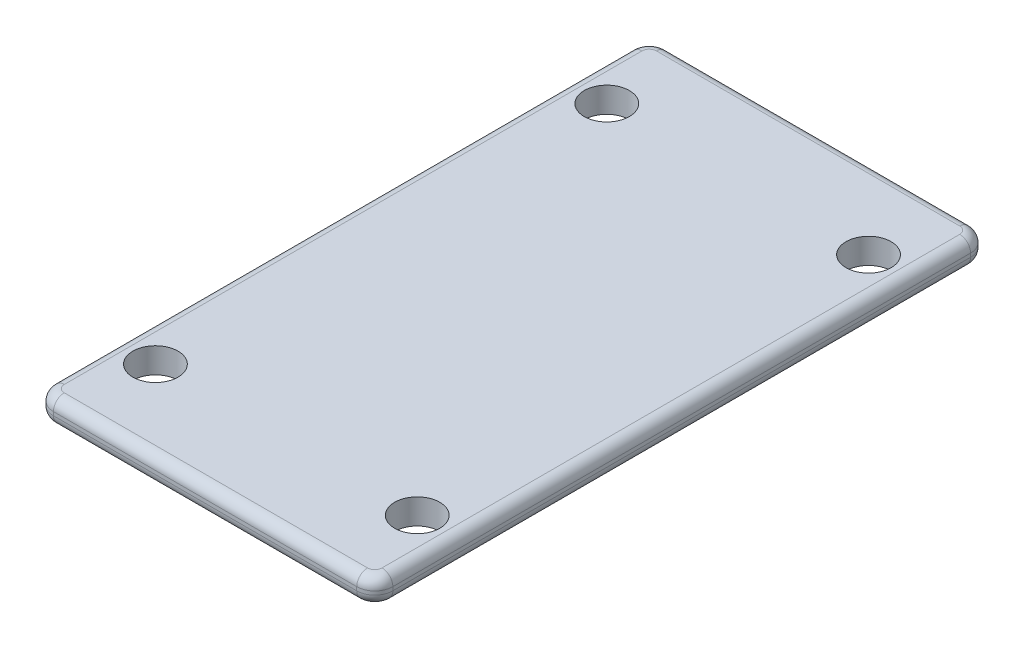
ISO-10303-21;
HEADER;
FILE_DESCRIPTION(('STEP AP214'),'2;1');
FILE_NAME('part.step','',(''),(''),'','','');
FILE_SCHEMA(('AUTOMOTIVE_DESIGN { 1 0 10303 214 1 1 1 1 }'));
ENDSEC;
DATA;
#1=APPLICATION_CONTEXT('core data for automotive mechanical design processes');
#2=APPLICATION_PROTOCOL_DEFINITION('international standard','automotive_design',2000,#1);
#3=PRODUCT_CONTEXT('',#1,'mechanical');
#4=PRODUCT('Part','Part','',(#3));
#5=PRODUCT_RELATED_PRODUCT_CATEGORY('part','',(#4));
#6=PRODUCT_DEFINITION_FORMATION('','',#4);
#7=PRODUCT_DEFINITION_CONTEXT('part definition',#1,'design');
#8=PRODUCT_DEFINITION('design','',#6,#7);
#9=PRODUCT_DEFINITION_SHAPE('','',#8);
#10=(LENGTH_UNIT() NAMED_UNIT(*) SI_UNIT(.MILLI.,.METRE.));
#11=(NAMED_UNIT(*) PLANE_ANGLE_UNIT() SI_UNIT($,.RADIAN.));
#12=(NAMED_UNIT(*) SI_UNIT($,.STERADIAN.) SOLID_ANGLE_UNIT());
#13=UNCERTAINTY_MEASURE_WITH_UNIT(LENGTH_MEASURE(1.E-05),#10,'distance_accuracy_value','');
#14=(GEOMETRIC_REPRESENTATION_CONTEXT(3) GLOBAL_UNCERTAINTY_ASSIGNED_CONTEXT((#13)) GLOBAL_UNIT_ASSIGNED_CONTEXT((#10,
#11,#12)) REPRESENTATION_CONTEXT('',''));
#15=CARTESIAN_POINT('',(0.,0.,0.));
#16=DIRECTION('',(0.,0.,1.));
#17=DIRECTION('',(1.,0.,0.));
#18=AXIS2_PLACEMENT_3D('',#15,#16,#17);
#19=CARTESIAN_POINT('',(0.,1.4,0.));
#20=DIRECTION('',(0.,1.,0.));
#21=DIRECTION('',(0.,0.,1.));
#22=AXIS2_PLACEMENT_3D('',#19,#20,#21);
#23=PLANE('',#22);
#24=CARTESIAN_POINT('',(8.4,1.4,16.));
#25=DIRECTION('',(0.,1.,0.));
#26=DIRECTION('',(0.,0.,1.));
#27=AXIS2_PLACEMENT_3D('',#24,#25,#26);
#28=CIRCLE('',#27,0.4);
#29=CARTESIAN_POINT('',(8.4,1.4,16.4));
#30=VERTEX_POINT('',#29);
#31=CARTESIAN_POINT('',(8.8,1.4,16.));
#32=VERTEX_POINT('',#31);
#33=EDGE_CURVE('E56',#30,#32,#28,.T.);
#34=ORIENTED_EDGE('',*,*,#33,.T.);
#35=DIRECTION('',(0.,0.,-1.));
#36=VECTOR('',#35,1.);
#37=CARTESIAN_POINT('',(8.8,1.4,-16.));
#38=LINE('',#37,#36);
#39=CARTESIAN_POINT('',(8.8,1.4,-16.));
#40=VERTEX_POINT('',#39);
#41=EDGE_CURVE('E51',#32,#40,#38,.T.);
#42=ORIENTED_EDGE('',*,*,#41,.T.);
#43=CARTESIAN_POINT('',(8.4,1.4,-16.));
#44=DIRECTION('',(0.,1.,0.));
#45=DIRECTION('',(0.,0.,1.));
#46=AXIS2_PLACEMENT_3D('',#43,#44,#45);
#47=CIRCLE('',#46,0.4);
#48=CARTESIAN_POINT('',(8.4,1.4,-16.4));
#49=VERTEX_POINT('',#48);
#50=EDGE_CURVE('E220',#40,#49,#47,.T.);
#51=ORIENTED_EDGE('',*,*,#50,.T.);
#52=DIRECTION('',(-1.,0.,0.));
#53=VECTOR('',#52,1.);
#54=CARTESIAN_POINT('',(-8.4,1.4,-16.4));
#55=LINE('',#54,#53);
#56=CARTESIAN_POINT('',(-8.4,1.4,-16.4));
#57=VERTEX_POINT('',#56);
#58=EDGE_CURVE('E215',#49,#57,#55,.T.);
#59=ORIENTED_EDGE('',*,*,#58,.T.);
#60=CARTESIAN_POINT('',(-8.4,1.4,-16.));
#61=DIRECTION('',(0.,1.,0.));
#62=DIRECTION('',(0.,0.,1.));
#63=AXIS2_PLACEMENT_3D('',#60,#61,#62);
#64=CIRCLE('',#63,0.4);
#65=CARTESIAN_POINT('',(-8.8,1.4,-16.));
#66=VERTEX_POINT('',#65);
#67=EDGE_CURVE('E212',#57,#66,#64,.T.);
#68=ORIENTED_EDGE('',*,*,#67,.T.);
#69=DIRECTION('',(0.,0.,1.));
#70=VECTOR('',#69,1.);
#71=CARTESIAN_POINT('',(-8.8,1.4,16.));
#72=LINE('',#71,#70);
#73=CARTESIAN_POINT('',(-8.8,1.4,16.));
#74=VERTEX_POINT('',#73);
#75=EDGE_CURVE('E208',#66,#74,#72,.T.);
#76=ORIENTED_EDGE('',*,*,#75,.T.);
#77=CARTESIAN_POINT('',(-8.4,1.4,16.));
#78=DIRECTION('',(0.,1.,0.));
#79=DIRECTION('',(0.,0.,1.));
#80=AXIS2_PLACEMENT_3D('',#77,#78,#79);
#81=CIRCLE('',#80,0.4);
#82=CARTESIAN_POINT('',(-8.4,1.4,16.4));
#83=VERTEX_POINT('',#82);
#84=EDGE_CURVE('E210',#74,#83,#81,.T.);
#85=ORIENTED_EDGE('',*,*,#84,.T.);
#86=DIRECTION('',(1.,0.,0.));
#87=VECTOR('',#86,1.);
#88=CARTESIAN_POINT('',(8.4,1.4,16.4));
#89=LINE('',#88,#87);
#90=EDGE_CURVE('E217',#83,#30,#89,.T.);
#91=ORIENTED_EDGE('',*,*,#90,.T.);
#92=EDGE_LOOP('',(#34,#42,#51,#59,#68,#76,#85,#91));
#93=FACE_BOUND('',#92,.T.);
#94=CARTESIAN_POINT('',(-7.25,1.4,12.5));
#95=DIRECTION('',(0.,1.,0.));
#96=DIRECTION('',(0.,0.,1.));
#97=AXIS2_PLACEMENT_3D('',#94,#95,#96);
#98=CIRCLE('',#97,1.25);
#99=CARTESIAN_POINT('',(-7.25,1.4,13.75));
#100=VERTEX_POINT('',#99);
#101=EDGE_CURVE('E638',#100,#100,#98,.T.);
#102=ORIENTED_EDGE('',*,*,#101,.F.);
#103=EDGE_LOOP('',(#102));
#104=FACE_BOUND('',#103,.T.);
#105=CARTESIAN_POINT('',(-7.25,1.4,-12.5));
#106=DIRECTION('',(0.,1.,0.));
#107=DIRECTION('',(0.,0.,1.));
#108=AXIS2_PLACEMENT_3D('',#105,#106,#107);
#109=CIRCLE('',#108,1.25);
#110=CARTESIAN_POINT('',(-7.25,1.4,-11.25));
#111=VERTEX_POINT('',#110);
#112=EDGE_CURVE('E294',#111,#111,#109,.T.);
#113=ORIENTED_EDGE('',*,*,#112,.F.);
#114=EDGE_LOOP('',(#113));
#115=FACE_BOUND('',#114,.T.);
#116=CARTESIAN_POINT('',(7.25,1.4,-12.5));
#117=DIRECTION('',(0.,1.,0.));
#118=DIRECTION('',(0.,0.,1.));
#119=AXIS2_PLACEMENT_3D('',#116,#117,#118);
#120=CIRCLE('',#119,1.25);
#121=CARTESIAN_POINT('',(7.25,1.4,-11.25));
#122=VERTEX_POINT('',#121);
#123=EDGE_CURVE('E632',#122,#122,#120,.T.);
#124=ORIENTED_EDGE('',*,*,#123,.F.);
#125=EDGE_LOOP('',(#124));
#126=FACE_BOUND('',#125,.T.);
#127=CARTESIAN_POINT('',(7.25,1.4,12.5));
#128=DIRECTION('',(0.,1.,0.));
#129=DIRECTION('',(0.,0.,1.));
#130=AXIS2_PLACEMENT_3D('',#127,#128,#129);
#131=CIRCLE('',#130,1.25);
#132=CARTESIAN_POINT('',(7.25,1.4,13.75));
#133=VERTEX_POINT('',#132);
#134=EDGE_CURVE('E644',#133,#133,#131,.T.);
#135=ORIENTED_EDGE('',*,*,#134,.F.);
#136=EDGE_LOOP('',(#135));
#137=FACE_BOUND('',#136,.T.);
#138=ADVANCED_FACE('F34',(#93,#104,#115,#126,#137),#23,.T.);
#139=CARTESIAN_POINT('',(0.,0.,0.));
#140=DIRECTION('',(0.,1.,0.));
#141=DIRECTION('',(0.,0.,1.));
#142=AXIS2_PLACEMENT_3D('',#139,#140,#141);
#143=PLANE('',#142);
#144=CARTESIAN_POINT('',(8.4,0.,-16.));
#145=DIRECTION('',(0.,1.,0.));
#146=DIRECTION('',(0.,0.,1.));
#147=AXIS2_PLACEMENT_3D('',#144,#145,#146);
#148=CIRCLE('',#147,0.4);
#149=CARTESIAN_POINT('',(8.4,0.,-16.4));
#150=VERTEX_POINT('',#149);
#151=CARTESIAN_POINT('',(8.8,0.,-16.));
#152=VERTEX_POINT('',#151);
#153=EDGE_CURVE('E187',#150,#152,#148,.F.);
#154=ORIENTED_EDGE('',*,*,#153,.T.);
#155=DIRECTION('',(0.,0.,-1.));
#156=VECTOR('',#155,1.);
#157=CARTESIAN_POINT('',(8.8,0.,0.));
#158=LINE('',#157,#156);
#159=CARTESIAN_POINT('',(8.8,0.,16.));
#160=VERTEX_POINT('',#159);
#161=EDGE_CURVE('E189',#152,#160,#158,.F.);
#162=ORIENTED_EDGE('',*,*,#161,.T.);
#163=CARTESIAN_POINT('',(8.4,0.,16.));
#164=DIRECTION('',(0.,1.,0.));
#165=DIRECTION('',(0.,0.,1.));
#166=AXIS2_PLACEMENT_3D('',#163,#164,#165);
#167=CIRCLE('',#166,0.4);
#168=CARTESIAN_POINT('',(8.4,0.,16.4));
#169=VERTEX_POINT('',#168);
#170=EDGE_CURVE('E185',#160,#169,#167,.F.);
#171=ORIENTED_EDGE('',*,*,#170,.T.);
#172=DIRECTION('',(1.,0.,0.));
#173=VECTOR('',#172,1.);
#174=CARTESIAN_POINT('',(0.,0.,16.4));
#175=LINE('',#174,#173);
#176=CARTESIAN_POINT('',(-8.4,0.,16.4));
#177=VERTEX_POINT('',#176);
#178=EDGE_CURVE('E155',#169,#177,#175,.F.);
#179=ORIENTED_EDGE('',*,*,#178,.T.);
#180=CARTESIAN_POINT('',(-8.4,0.,16.));
#181=DIRECTION('',(0.,1.,0.));
#182=DIRECTION('',(0.,0.,1.));
#183=AXIS2_PLACEMENT_3D('',#180,#181,#182);
#184=CIRCLE('',#183,0.4);
#185=CARTESIAN_POINT('',(-8.8,0.,16.));
#186=VERTEX_POINT('',#185);
#187=EDGE_CURVE('E146',#177,#186,#184,.F.);
#188=ORIENTED_EDGE('',*,*,#187,.T.);
#189=DIRECTION('',(0.,0.,1.));
#190=VECTOR('',#189,1.);
#191=CARTESIAN_POINT('',(-8.8,0.,0.));
#192=LINE('',#191,#190);
#193=CARTESIAN_POINT('',(-8.8,0.,-16.));
#194=VERTEX_POINT('',#193);
#195=EDGE_CURVE('E152',#186,#194,#192,.F.);
#196=ORIENTED_EDGE('',*,*,#195,.T.);
#197=CARTESIAN_POINT('',(-8.4,0.,-16.));
#198=DIRECTION('',(0.,1.,0.));
#199=DIRECTION('',(0.,0.,1.));
#200=AXIS2_PLACEMENT_3D('',#197,#198,#199);
#201=CIRCLE('',#200,0.4);
#202=CARTESIAN_POINT('',(-8.4,0.,-16.4));
#203=VERTEX_POINT('',#202);
#204=EDGE_CURVE('E159',#194,#203,#201,.F.);
#205=ORIENTED_EDGE('',*,*,#204,.T.);
#206=DIRECTION('',(-1.,0.,0.));
#207=VECTOR('',#206,1.);
#208=CARTESIAN_POINT('',(0.,0.,-16.4));
#209=LINE('',#208,#207);
#210=EDGE_CURVE('E182',#203,#150,#209,.F.);
#211=ORIENTED_EDGE('',*,*,#210,.T.);
#212=EDGE_LOOP('',(#154,#162,#171,#179,#188,#196,#205,#211));
#213=FACE_BOUND('',#212,.T.);
#214=CARTESIAN_POINT('',(-7.25,0.,-12.5));
#215=DIRECTION('',(0.,1.,0.));
#216=DIRECTION('',(0.,0.,1.));
#217=AXIS2_PLACEMENT_3D('',#214,#215,#216);
#218=CIRCLE('',#217,1.25);
#219=CARTESIAN_POINT('',(-7.25,0.,-11.25));
#220=VERTEX_POINT('',#219);
#221=EDGE_CURVE('E299',#220,#220,#218,.T.);
#222=ORIENTED_EDGE('',*,*,#221,.T.);
#223=EDGE_LOOP('',(#222));
#224=FACE_BOUND('',#223,.T.);
#225=CARTESIAN_POINT('',(7.25,0.,-12.5));
#226=DIRECTION('',(0.,1.,0.));
#227=DIRECTION('',(0.,0.,1.));
#228=AXIS2_PLACEMENT_3D('',#225,#226,#227);
#229=CIRCLE('',#228,1.25);
#230=CARTESIAN_POINT('',(7.25,0.,-11.25));
#231=VERTEX_POINT('',#230);
#232=EDGE_CURVE('E634',#231,#231,#229,.T.);
#233=ORIENTED_EDGE('',*,*,#232,.T.);
#234=EDGE_LOOP('',(#233));
#235=FACE_BOUND('',#234,.T.);
#236=CARTESIAN_POINT('',(-7.25,0.,12.5));
#237=DIRECTION('',(0.,1.,0.));
#238=DIRECTION('',(0.,0.,1.));
#239=AXIS2_PLACEMENT_3D('',#236,#237,#238);
#240=CIRCLE('',#239,1.25);
#241=CARTESIAN_POINT('',(-7.25,0.,13.75));
#242=VERTEX_POINT('',#241);
#243=EDGE_CURVE('E641',#242,#242,#240,.T.);
#244=ORIENTED_EDGE('',*,*,#243,.T.);
#245=EDGE_LOOP('',(#244));
#246=FACE_BOUND('',#245,.T.);
#247=CARTESIAN_POINT('',(7.25,0.,12.5));
#248=DIRECTION('',(0.,1.,0.));
#249=DIRECTION('',(0.,0.,1.));
#250=AXIS2_PLACEMENT_3D('',#247,#248,#249);
#251=CIRCLE('',#250,1.25);
#252=CARTESIAN_POINT('',(7.25,0.,13.75));
#253=VERTEX_POINT('',#252);
#254=EDGE_CURVE('E251',#253,#253,#251,.T.);
#255=ORIENTED_EDGE('',*,*,#254,.T.);
#256=EDGE_LOOP('',(#255));
#257=FACE_BOUND('',#256,.T.);
#258=ADVANCED_FACE('F148',(#213,#224,#235,#246,#257),#143,.F.);
#259=CARTESIAN_POINT('',(-9.4,1.4,17.));
#260=DIRECTION('',(1.,0.,0.));
#261=DIRECTION('',(0.,0.,-1.));
#262=AXIS2_PLACEMENT_3D('',#259,#260,#261);
#263=PLANE('',#262);
#264=DIRECTION('',(0.,-1.,0.));
#265=VECTOR('',#264,1.);
#266=CARTESIAN_POINT('',(-9.4,1.4,-16.));
#267=LINE('',#266,#265);
#268=CARTESIAN_POINT('',(-9.4,0.8,-16.));
#269=VERTEX_POINT('',#268);
#270=CARTESIAN_POINT('',(-9.4,0.6,-16.));
#271=VERTEX_POINT('',#270);
#272=EDGE_CURVE('E296',#269,#271,#267,.T.);
#273=ORIENTED_EDGE('',*,*,#272,.T.);
#274=DIRECTION('',(0.,0.,1.));
#275=VECTOR('',#274,1.);
#276=CARTESIAN_POINT('',(-9.4,0.6,17.));
#277=LINE('',#276,#275);
#278=CARTESIAN_POINT('',(-9.4,0.6,16.));
#279=VERTEX_POINT('',#278);
#280=EDGE_CURVE('E11',#271,#279,#277,.T.);
#281=ORIENTED_EDGE('',*,*,#280,.T.);
#282=DIRECTION('',(0.,-1.,0.));
#283=VECTOR('',#282,1.);
#284=CARTESIAN_POINT('',(-9.4,1.4,16.));
#285=LINE('',#284,#283);
#286=CARTESIAN_POINT('',(-9.4,0.8,16.));
#287=VERTEX_POINT('',#286);
#288=EDGE_CURVE('E305',#279,#287,#285,.F.);
#289=ORIENTED_EDGE('',*,*,#288,.T.);
#290=DIRECTION('',(0.,0.,1.));
#291=VECTOR('',#290,1.);
#292=CARTESIAN_POINT('',(-9.4,0.8,-16.));
#293=LINE('',#292,#291);
#294=EDGE_CURVE('E43',#287,#269,#293,.F.);
#295=ORIENTED_EDGE('',*,*,#294,.T.);
#296=EDGE_LOOP('',(#273,#281,#289,#295));
#297=FACE_BOUND('',#296,.T.);
#298=ADVANCED_FACE('F359',(#297),#263,.F.);
#299=CARTESIAN_POINT('',(9.4,1.4,17.));
#300=DIRECTION('',(0.,0.,-1.));
#301=DIRECTION('',(-1.,0.,0.));
#302=AXIS2_PLACEMENT_3D('',#299,#300,#301);
#303=PLANE('',#302);
#304=DIRECTION('',(0.,-1.,0.));
#305=VECTOR('',#304,1.);
#306=CARTESIAN_POINT('',(-8.4,1.4,17.));
#307=LINE('',#306,#305);
#308=CARTESIAN_POINT('',(-8.4,0.8,17.));
#309=VERTEX_POINT('',#308);
#310=CARTESIAN_POINT('',(-8.4,0.6,17.));
#311=VERTEX_POINT('',#310);
#312=EDGE_CURVE('E293',#309,#311,#307,.T.);
#313=ORIENTED_EDGE('',*,*,#312,.T.);
#314=DIRECTION('',(1.,0.,0.));
#315=VECTOR('',#314,1.);
#316=CARTESIAN_POINT('',(9.4,0.6,17.));
#317=LINE('',#316,#315);
#318=CARTESIAN_POINT('',(8.4,0.6,17.));
#319=VERTEX_POINT('',#318);
#320=EDGE_CURVE('E225',#311,#319,#317,.T.);
#321=ORIENTED_EDGE('',*,*,#320,.T.);
#322=DIRECTION('',(0.,-1.,0.));
#323=VECTOR('',#322,1.);
#324=CARTESIAN_POINT('',(8.4,1.4,17.));
#325=LINE('',#324,#323);
#326=CARTESIAN_POINT('',(8.4,0.8,17.));
#327=VERTEX_POINT('',#326);
#328=EDGE_CURVE('E284',#319,#327,#325,.F.);
#329=ORIENTED_EDGE('',*,*,#328,.T.);
#330=DIRECTION('',(1.,0.,0.));
#331=VECTOR('',#330,1.);
#332=CARTESIAN_POINT('',(-8.4,0.8,17.));
#333=LINE('',#332,#331);
#334=EDGE_CURVE('E223',#327,#309,#333,.F.);
#335=ORIENTED_EDGE('',*,*,#334,.T.);
#336=EDGE_LOOP('',(#313,#321,#329,#335));
#337=FACE_BOUND('',#336,.T.);
#338=ADVANCED_FACE('F290',(#337),#303,.F.);
#339=CARTESIAN_POINT('',(9.4,1.4,17.));
#340=DIRECTION('',(-1.,0.,0.));
#341=DIRECTION('',(0.,0.,1.));
#342=AXIS2_PLACEMENT_3D('',#339,#340,#341);
#343=PLANE('',#342);
#344=DIRECTION('',(0.,-1.,0.));
#345=VECTOR('',#344,1.);
#346=CARTESIAN_POINT('',(9.4,1.4,16.));
#347=LINE('',#346,#345);
#348=CARTESIAN_POINT('',(9.4,0.8,16.));
#349=VERTEX_POINT('',#348);
#350=CARTESIAN_POINT('',(9.4,0.6,16.));
#351=VERTEX_POINT('',#350);
#352=EDGE_CURVE('E287',#349,#351,#347,.T.);
#353=ORIENTED_EDGE('',*,*,#352,.T.);
#354=DIRECTION('',(0.,0.,-1.));
#355=VECTOR('',#354,1.);
#356=CARTESIAN_POINT('',(9.4,0.6,17.));
#357=LINE('',#356,#355);
#358=CARTESIAN_POINT('',(9.4,0.6,-16.));
#359=VERTEX_POINT('',#358);
#360=EDGE_CURVE('E229',#351,#359,#357,.T.);
#361=ORIENTED_EDGE('',*,*,#360,.T.);
#362=DIRECTION('',(0.,-1.,0.));
#363=VECTOR('',#362,1.);
#364=CARTESIAN_POINT('',(9.4,1.4,-16.));
#365=LINE('',#364,#363);
#366=CARTESIAN_POINT('',(9.4,0.8,-16.));
#367=VERTEX_POINT('',#366);
#368=EDGE_CURVE('E308',#359,#367,#365,.F.);
#369=ORIENTED_EDGE('',*,*,#368,.T.);
#370=DIRECTION('',(0.,0.,-1.));
#371=VECTOR('',#370,1.);
#372=CARTESIAN_POINT('',(9.4,0.8,16.));
#373=LINE('',#372,#371);
#374=EDGE_CURVE('E227',#367,#349,#373,.F.);
#375=ORIENTED_EDGE('',*,*,#374,.T.);
#376=EDGE_LOOP('',(#353,#361,#369,#375));
#377=FACE_BOUND('',#376,.T.);
#378=ADVANCED_FACE('F368',(#377),#343,.F.);
#379=CARTESIAN_POINT('',(9.4,1.4,-17.));
#380=DIRECTION('',(0.,0.,1.));
#381=DIRECTION('',(1.,0.,0.));
#382=AXIS2_PLACEMENT_3D('',#379,#380,#381);
#383=PLANE('',#382);
#384=DIRECTION('',(0.,-1.,0.));
#385=VECTOR('',#384,1.);
#386=CARTESIAN_POINT('',(8.4,1.4,-17.));
#387=LINE('',#386,#385);
#388=CARTESIAN_POINT('',(8.4,0.8,-17.));
#389=VERTEX_POINT('',#388);
#390=CARTESIAN_POINT('',(8.4,0.6,-17.));
#391=VERTEX_POINT('',#390);
#392=EDGE_CURVE('E174',#389,#391,#387,.T.);
#393=ORIENTED_EDGE('',*,*,#392,.T.);
#394=DIRECTION('',(-1.,0.,0.));
#395=VECTOR('',#394,1.);
#396=CARTESIAN_POINT('',(9.4,0.6,-17.));
#397=LINE('',#396,#395);
#398=CARTESIAN_POINT('',(-8.4,0.6,-17.));
#399=VERTEX_POINT('',#398);
#400=EDGE_CURVE('E233',#391,#399,#397,.T.);
#401=ORIENTED_EDGE('',*,*,#400,.T.);
#402=DIRECTION('',(0.,-1.,0.));
#403=VECTOR('',#402,1.);
#404=CARTESIAN_POINT('',(-8.4,1.4,-17.));
#405=LINE('',#404,#403);
#406=CARTESIAN_POINT('',(-8.4,0.8,-17.));
#407=VERTEX_POINT('',#406);
#408=EDGE_CURVE('E177',#399,#407,#405,.F.);
#409=ORIENTED_EDGE('',*,*,#408,.T.);
#410=DIRECTION('',(-1.,0.,0.));
#411=VECTOR('',#410,1.);
#412=CARTESIAN_POINT('',(8.4,0.8,-17.));
#413=LINE('',#412,#411);
#414=EDGE_CURVE('E231',#407,#389,#413,.F.);
#415=ORIENTED_EDGE('',*,*,#414,.T.);
#416=EDGE_LOOP('',(#393,#401,#409,#415));
#417=FACE_BOUND('',#416,.T.);
#418=ADVANCED_FACE('F314',(#417),#383,.F.);
#419=CARTESIAN_POINT('',(-7.25,1.4,-12.5));
#420=DIRECTION('',(0.,-1.,0.));
#421=DIRECTION('',(0.,0.,-1.));
#422=AXIS2_PLACEMENT_3D('',#419,#420,#421);
#423=CYLINDRICAL_SURFACE('',#422,1.25);
#424=ORIENTED_EDGE('',*,*,#112,.T.);
#425=EDGE_LOOP('',(#424));
#426=FACE_BOUND('',#425,.T.);
#427=ORIENTED_EDGE('',*,*,#221,.F.);
#428=EDGE_LOOP('',(#427));
#429=FACE_BOUND('',#428,.T.);
#430=ADVANCED_FACE('F363',(#426,#429),#423,.F.);
#431=CARTESIAN_POINT('',(7.25,1.4,-12.5));
#432=DIRECTION('',(0.,-1.,0.));
#433=DIRECTION('',(0.,0.,-1.));
#434=AXIS2_PLACEMENT_3D('',#431,#432,#433);
#435=CYLINDRICAL_SURFACE('',#434,1.25);
#436=ORIENTED_EDGE('',*,*,#123,.T.);
#437=EDGE_LOOP('',(#436));
#438=FACE_BOUND('',#437,.T.);
#439=ORIENTED_EDGE('',*,*,#232,.F.);
#440=EDGE_LOOP('',(#439));
#441=FACE_BOUND('',#440,.T.);
#442=ADVANCED_FACE('F569',(#438,#441),#435,.F.);
#443=CARTESIAN_POINT('',(-7.25,1.4,12.5));
#444=DIRECTION('',(0.,-1.,0.));
#445=DIRECTION('',(0.,0.,-1.));
#446=AXIS2_PLACEMENT_3D('',#443,#444,#445);
#447=CYLINDRICAL_SURFACE('',#446,1.25);
#448=ORIENTED_EDGE('',*,*,#101,.T.);
#449=EDGE_LOOP('',(#448));
#450=FACE_BOUND('',#449,.T.);
#451=ORIENTED_EDGE('',*,*,#243,.F.);
#452=EDGE_LOOP('',(#451));
#453=FACE_BOUND('',#452,.T.);
#454=ADVANCED_FACE('F560',(#450,#453),#447,.F.);
#455=CARTESIAN_POINT('',(7.25,1.4,12.5));
#456=DIRECTION('',(0.,-1.,0.));
#457=DIRECTION('',(0.,0.,-1.));
#458=AXIS2_PLACEMENT_3D('',#455,#456,#457);
#459=CYLINDRICAL_SURFACE('',#458,1.25);
#460=ORIENTED_EDGE('',*,*,#134,.T.);
#461=EDGE_LOOP('',(#460));
#462=FACE_BOUND('',#461,.T.);
#463=ORIENTED_EDGE('',*,*,#254,.F.);
#464=EDGE_LOOP('',(#463));
#465=FACE_BOUND('',#464,.T.);
#466=ADVANCED_FACE('F380',(#462,#465),#459,.F.);
#467=CARTESIAN_POINT('',(-8.4,1.4,16.));
#468=DIRECTION('',(0.,-1.,0.));
#469=DIRECTION('',(0.,0.,-1.));
#470=AXIS2_PLACEMENT_3D('',#467,#468,#469);
#471=CYLINDRICAL_SURFACE('',#470,1.);
#472=ORIENTED_EDGE('',*,*,#288,.F.);
#473=CARTESIAN_POINT('',(-8.4,0.6,16.));
#474=DIRECTION('',(0.,1.,0.));
#475=DIRECTION('',(0.,0.,1.));
#476=AXIS2_PLACEMENT_3D('',#473,#474,#475);
#477=CIRCLE('',#476,1.);
#478=EDGE_CURVE('E165',#279,#311,#477,.T.);
#479=ORIENTED_EDGE('',*,*,#478,.T.);
#480=ORIENTED_EDGE('',*,*,#312,.F.);
#481=CARTESIAN_POINT('',(-8.4,0.8,16.));
#482=DIRECTION('',(0.,1.,0.));
#483=DIRECTION('',(0.,0.,1.));
#484=AXIS2_PLACEMENT_3D('',#481,#482,#483);
#485=CIRCLE('',#484,1.);
#486=EDGE_CURVE('E205',#309,#287,#485,.F.);
#487=ORIENTED_EDGE('',*,*,#486,.T.);
#488=EDGE_LOOP('',(#472,#479,#480,#487));
#489=FACE_BOUND('',#488,.T.);
#490=ADVANCED_FACE('F377',(#489),#471,.T.);
#491=CARTESIAN_POINT('',(8.4,1.4,16.));
#492=DIRECTION('',(0.,-1.,0.));
#493=DIRECTION('',(0.,0.,-1.));
#494=AXIS2_PLACEMENT_3D('',#491,#492,#493);
#495=CYLINDRICAL_SURFACE('',#494,1.);
#496=ORIENTED_EDGE('',*,*,#328,.F.);
#497=CARTESIAN_POINT('',(8.4,0.6,16.));
#498=DIRECTION('',(0.,1.,0.));
#499=DIRECTION('',(0.,0.,1.));
#500=AXIS2_PLACEMENT_3D('',#497,#498,#499);
#501=CIRCLE('',#500,1.);
#502=EDGE_CURVE('E203',#319,#351,#501,.T.);
#503=ORIENTED_EDGE('',*,*,#502,.T.);
#504=ORIENTED_EDGE('',*,*,#352,.F.);
#505=CARTESIAN_POINT('',(8.4,0.8,16.));
#506=DIRECTION('',(0.,1.,0.));
#507=DIRECTION('',(0.,0.,1.));
#508=AXIS2_PLACEMENT_3D('',#505,#506,#507);
#509=CIRCLE('',#508,1.);
#510=EDGE_CURVE('E201',#349,#327,#509,.F.);
#511=ORIENTED_EDGE('',*,*,#510,.T.);
#512=EDGE_LOOP('',(#496,#503,#504,#511));
#513=FACE_BOUND('',#512,.T.);
#514=ADVANCED_FACE('F283',(#513),#495,.T.);
#515=CARTESIAN_POINT('',(8.4,1.4,-16.));
#516=DIRECTION('',(0.,-1.,0.));
#517=DIRECTION('',(0.,0.,-1.));
#518=AXIS2_PLACEMENT_3D('',#515,#516,#517);
#519=CYLINDRICAL_SURFACE('',#518,1.);
#520=ORIENTED_EDGE('',*,*,#368,.F.);
#521=CARTESIAN_POINT('',(8.4,0.6,-16.));
#522=DIRECTION('',(0.,1.,0.));
#523=DIRECTION('',(0.,0.,1.));
#524=AXIS2_PLACEMENT_3D('',#521,#522,#523);
#525=CIRCLE('',#524,1.);
#526=EDGE_CURVE('E199',#359,#391,#525,.T.);
#527=ORIENTED_EDGE('',*,*,#526,.T.);
#528=ORIENTED_EDGE('',*,*,#392,.F.);
#529=CARTESIAN_POINT('',(8.4,0.8,-16.));
#530=DIRECTION('',(0.,1.,0.));
#531=DIRECTION('',(0.,0.,1.));
#532=AXIS2_PLACEMENT_3D('',#529,#530,#531);
#533=CIRCLE('',#532,1.);
#534=EDGE_CURVE('E197',#389,#367,#533,.F.);
#535=ORIENTED_EDGE('',*,*,#534,.T.);
#536=EDGE_LOOP('',(#520,#527,#528,#535));
#537=FACE_BOUND('',#536,.T.);
#538=ADVANCED_FACE('F384',(#537),#519,.T.);
#539=CARTESIAN_POINT('',(-8.4,1.4,-16.));
#540=DIRECTION('',(0.,-1.,0.));
#541=DIRECTION('',(0.,0.,-1.));
#542=AXIS2_PLACEMENT_3D('',#539,#540,#541);
#543=CYLINDRICAL_SURFACE('',#542,1.);
#544=ORIENTED_EDGE('',*,*,#408,.F.);
#545=CARTESIAN_POINT('',(-8.4,0.6,-16.));
#546=DIRECTION('',(0.,1.,0.));
#547=DIRECTION('',(0.,0.,1.));
#548=AXIS2_PLACEMENT_3D('',#545,#546,#547);
#549=CIRCLE('',#548,1.);
#550=EDGE_CURVE('E194',#399,#271,#549,.T.);
#551=ORIENTED_EDGE('',*,*,#550,.T.);
#552=ORIENTED_EDGE('',*,*,#272,.F.);
#553=CARTESIAN_POINT('',(-8.4,0.8,-16.));
#554=DIRECTION('',(0.,1.,0.));
#555=DIRECTION('',(0.,0.,1.));
#556=AXIS2_PLACEMENT_3D('',#553,#554,#555);
#557=CIRCLE('',#556,1.);
#558=EDGE_CURVE('E191',#269,#407,#557,.F.);
#559=ORIENTED_EDGE('',*,*,#558,.T.);
#560=EDGE_LOOP('',(#544,#551,#552,#559));
#561=FACE_BOUND('',#560,.T.);
#562=ADVANCED_FACE('F320',(#561),#543,.T.);
#563=CARTESIAN_POINT('',(8.4,0.6,16.));
#564=DIRECTION('',(0.,1.,0.));
#565=DIRECTION('',(0.,0.,1.));
#566=AXIS2_PLACEMENT_3D('',#563,#564,#565);
#567=DEGENERATE_TOROIDAL_SURFACE('',#566,0.4,0.6,.T.);
#568=CARTESIAN_POINT('',(8.8,0.6,16.));
#569=DIRECTION('',(0.,0.,-1.));
#570=DIRECTION('',(-1.,0.,0.));
#571=AXIS2_PLACEMENT_3D('',#568,#569,#570);
#572=CIRCLE('',#571,0.6);
#573=EDGE_CURVE('E245',#351,#160,#572,.T.);
#574=ORIENTED_EDGE('',*,*,#573,.F.);
#575=ORIENTED_EDGE('',*,*,#502,.F.);
#576=CARTESIAN_POINT('',(8.4,0.6,16.4));
#577=DIRECTION('',(-1.,0.,0.));
#578=DIRECTION('',(0.,0.,1.));
#579=AXIS2_PLACEMENT_3D('',#576,#577,#578);
#580=CIRCLE('',#579,0.6);
#581=EDGE_CURVE('E248',#169,#319,#580,.T.);
#582=ORIENTED_EDGE('',*,*,#581,.F.);
#583=ORIENTED_EDGE('',*,*,#170,.F.);
#584=EDGE_LOOP('',(#574,#575,#582,#583));
#585=FACE_BOUND('',#584,.T.);
#586=ADVANCED_FACE('F343',(#585),#567,.T.);
#587=CARTESIAN_POINT('',(9.4,0.6,16.4));
#588=DIRECTION('',(1.,0.,0.));
#589=DIRECTION('',(0.,0.,-1.));
#590=AXIS2_PLACEMENT_3D('',#587,#588,#589);
#591=CYLINDRICAL_SURFACE('',#590,0.6);
#592=ORIENTED_EDGE('',*,*,#581,.T.);
#593=ORIENTED_EDGE('',*,*,#320,.F.);
#594=CARTESIAN_POINT('',(-8.4,0.6,16.4));
#595=DIRECTION('',(-1.,0.,0.));
#596=DIRECTION('',(0.,0.,1.));
#597=AXIS2_PLACEMENT_3D('',#594,#595,#596);
#598=CIRCLE('',#597,0.6);
#599=EDGE_CURVE('E243',#177,#311,#598,.T.);
#600=ORIENTED_EDGE('',*,*,#599,.F.);
#601=ORIENTED_EDGE('',*,*,#178,.F.);
#602=EDGE_LOOP('',(#592,#593,#600,#601));
#603=FACE_BOUND('',#602,.T.);
#604=ADVANCED_FACE('F345',(#603),#591,.T.);
#605=CARTESIAN_POINT('',(8.8,0.6,17.));
#606=DIRECTION('',(0.,0.,-1.));
#607=DIRECTION('',(-1.,0.,0.));
#608=AXIS2_PLACEMENT_3D('',#605,#606,#607);
#609=CYLINDRICAL_SURFACE('',#608,0.6);
#610=ORIENTED_EDGE('',*,*,#573,.T.);
#611=ORIENTED_EDGE('',*,*,#161,.F.);
#612=CARTESIAN_POINT('',(8.8,0.6,-16.));
#613=DIRECTION('',(0.,0.,-1.));
#614=DIRECTION('',(-1.,0.,0.));
#615=AXIS2_PLACEMENT_3D('',#612,#613,#614);
#616=CIRCLE('',#615,0.6);
#617=EDGE_CURVE('E168',#359,#152,#616,.T.);
#618=ORIENTED_EDGE('',*,*,#617,.F.);
#619=ORIENTED_EDGE('',*,*,#360,.F.);
#620=EDGE_LOOP('',(#610,#611,#618,#619));
#621=FACE_BOUND('',#620,.T.);
#622=ADVANCED_FACE('F338',(#621),#609,.T.);
#623=CARTESIAN_POINT('',(-8.4,0.6,16.));
#624=DIRECTION('',(0.,1.,0.));
#625=DIRECTION('',(0.,0.,1.));
#626=AXIS2_PLACEMENT_3D('',#623,#624,#625);
#627=DEGENERATE_TOROIDAL_SURFACE('',#626,0.4,0.6,.T.);
#628=ORIENTED_EDGE('',*,*,#599,.T.);
#629=ORIENTED_EDGE('',*,*,#478,.F.);
#630=CARTESIAN_POINT('',(-8.8,0.6,16.));
#631=DIRECTION('',(0.,0.,-1.));
#632=DIRECTION('',(-1.,0.,0.));
#633=AXIS2_PLACEMENT_3D('',#630,#631,#632);
#634=CIRCLE('',#633,0.6);
#635=EDGE_CURVE('E163',#186,#279,#634,.T.);
#636=ORIENTED_EDGE('',*,*,#635,.F.);
#637=ORIENTED_EDGE('',*,*,#187,.F.);
#638=EDGE_LOOP('',(#628,#629,#636,#637));
#639=FACE_BOUND('',#638,.T.);
#640=ADVANCED_FACE('F164',(#639),#627,.T.);
#641=CARTESIAN_POINT('',(8.4,0.6,-16.));
#642=DIRECTION('',(0.,1.,0.));
#643=DIRECTION('',(0.,0.,1.));
#644=AXIS2_PLACEMENT_3D('',#641,#642,#643);
#645=DEGENERATE_TOROIDAL_SURFACE('',#644,0.4,0.6,.T.);
#646=ORIENTED_EDGE('',*,*,#617,.T.);
#647=ORIENTED_EDGE('',*,*,#153,.F.);
#648=CARTESIAN_POINT('',(8.4,0.6,-16.4));
#649=DIRECTION('',(-1.,0.,0.));
#650=DIRECTION('',(0.,0.,1.));
#651=AXIS2_PLACEMENT_3D('',#648,#649,#650);
#652=CIRCLE('',#651,0.6);
#653=EDGE_CURVE('E169',#391,#150,#652,.T.);
#654=ORIENTED_EDGE('',*,*,#653,.F.);
#655=ORIENTED_EDGE('',*,*,#526,.F.);
#656=EDGE_LOOP('',(#646,#647,#654,#655));
#657=FACE_BOUND('',#656,.T.);
#658=ADVANCED_FACE('F333',(#657),#645,.T.);
#659=CARTESIAN_POINT('',(-8.8,0.6,17.));
#660=DIRECTION('',(0.,0.,1.));
#661=DIRECTION('',(1.,0.,0.));
#662=AXIS2_PLACEMENT_3D('',#659,#660,#661);
#663=CYLINDRICAL_SURFACE('',#662,0.6);
#664=ORIENTED_EDGE('',*,*,#635,.T.);
#665=ORIENTED_EDGE('',*,*,#280,.F.);
#666=CARTESIAN_POINT('',(-8.8,0.6,-16.));
#667=DIRECTION('',(0.,0.,-1.));
#668=DIRECTION('',(-1.,0.,0.));
#669=AXIS2_PLACEMENT_3D('',#666,#667,#668);
#670=CIRCLE('',#669,0.6);
#671=EDGE_CURVE('E172',#194,#271,#670,.T.);
#672=ORIENTED_EDGE('',*,*,#671,.F.);
#673=ORIENTED_EDGE('',*,*,#195,.F.);
#674=EDGE_LOOP('',(#664,#665,#672,#673));
#675=FACE_BOUND('',#674,.T.);
#676=ADVANCED_FACE('F171',(#675),#663,.T.);
#677=CARTESIAN_POINT('',(9.4,0.6,-16.4));
#678=DIRECTION('',(-1.,0.,0.));
#679=DIRECTION('',(0.,0.,1.));
#680=AXIS2_PLACEMENT_3D('',#677,#678,#679);
#681=CYLINDRICAL_SURFACE('',#680,0.6);
#682=ORIENTED_EDGE('',*,*,#653,.T.);
#683=ORIENTED_EDGE('',*,*,#210,.F.);
#684=CARTESIAN_POINT('',(-8.4,0.6,-16.4));
#685=DIRECTION('',(-1.,0.,0.));
#686=DIRECTION('',(0.,0.,1.));
#687=AXIS2_PLACEMENT_3D('',#684,#685,#686);
#688=CIRCLE('',#687,0.6);
#689=EDGE_CURVE('E236',#399,#203,#688,.T.);
#690=ORIENTED_EDGE('',*,*,#689,.F.);
#691=ORIENTED_EDGE('',*,*,#400,.F.);
#692=EDGE_LOOP('',(#682,#683,#690,#691));
#693=FACE_BOUND('',#692,.T.);
#694=ADVANCED_FACE('F328',(#693),#681,.T.);
#695=CARTESIAN_POINT('',(-8.4,0.6,-16.));
#696=DIRECTION('',(0.,1.,0.));
#697=DIRECTION('',(0.,0.,1.));
#698=AXIS2_PLACEMENT_3D('',#695,#696,#697);
#699=DEGENERATE_TOROIDAL_SURFACE('',#698,0.4,0.6,.T.);
#700=ORIENTED_EDGE('',*,*,#671,.T.);
#701=ORIENTED_EDGE('',*,*,#550,.F.);
#702=ORIENTED_EDGE('',*,*,#689,.T.);
#703=ORIENTED_EDGE('',*,*,#204,.F.);
#704=EDGE_LOOP('',(#700,#701,#702,#703));
#705=FACE_BOUND('',#704,.T.);
#706=ADVANCED_FACE('F325',(#705),#699,.T.);
#707=CARTESIAN_POINT('',(8.4,0.8,16.));
#708=DIRECTION('',(0.,1.,0.));
#709=DIRECTION('',(0.,0.,1.));
#710=AXIS2_PLACEMENT_3D('',#707,#708,#709);
#711=DEGENERATE_TOROIDAL_SURFACE('',#710,0.4,0.6,.T.);
#712=CARTESIAN_POINT('',(8.4,0.8,16.4));
#713=DIRECTION('',(-1.,0.,0.));
#714=DIRECTION('',(0.,0.,1.));
#715=AXIS2_PLACEMENT_3D('',#712,#713,#714);
#716=CIRCLE('',#715,0.6);
#717=EDGE_CURVE('E267',#327,#30,#716,.T.);
#718=ORIENTED_EDGE('',*,*,#717,.F.);
#719=ORIENTED_EDGE('',*,*,#510,.F.);
#720=CARTESIAN_POINT('',(8.8,0.8,16.));
#721=DIRECTION('',(0.,0.,-1.));
#722=DIRECTION('',(-1.,0.,0.));
#723=AXIS2_PLACEMENT_3D('',#720,#721,#722);
#724=CIRCLE('',#723,0.6);
#725=EDGE_CURVE('E38',#32,#349,#724,.T.);
#726=ORIENTED_EDGE('',*,*,#725,.F.);
#727=ORIENTED_EDGE('',*,*,#33,.F.);
#728=EDGE_LOOP('',(#718,#719,#726,#727));
#729=FACE_BOUND('',#728,.T.);
#730=ADVANCED_FACE('F36',(#729),#711,.T.);
#731=CARTESIAN_POINT('',(8.8,0.8,0.));
#732=DIRECTION('',(0.,0.,1.));
#733=DIRECTION('',(1.,0.,0.));
#734=AXIS2_PLACEMENT_3D('',#731,#732,#733);
#735=CYLINDRICAL_SURFACE('',#734,0.6);
#736=ORIENTED_EDGE('',*,*,#725,.T.);
#737=ORIENTED_EDGE('',*,*,#374,.F.);
#738=CARTESIAN_POINT('',(8.8,0.8,-16.));
#739=DIRECTION('',(0.,0.,-1.));
#740=DIRECTION('',(-1.,0.,0.));
#741=AXIS2_PLACEMENT_3D('',#738,#739,#740);
#742=CIRCLE('',#741,0.6);
#743=EDGE_CURVE('E265',#40,#367,#742,.T.);
#744=ORIENTED_EDGE('',*,*,#743,.F.);
#745=ORIENTED_EDGE('',*,*,#41,.F.);
#746=EDGE_LOOP('',(#736,#737,#744,#745));
#747=FACE_BOUND('',#746,.T.);
#748=ADVANCED_FACE('F276',(#747),#735,.T.);
#749=CARTESIAN_POINT('',(0.,0.8,16.4));
#750=DIRECTION('',(-1.,0.,0.));
#751=DIRECTION('',(0.,0.,1.));
#752=AXIS2_PLACEMENT_3D('',#749,#750,#751);
#753=CYLINDRICAL_SURFACE('',#752,0.6);
#754=ORIENTED_EDGE('',*,*,#717,.T.);
#755=ORIENTED_EDGE('',*,*,#90,.F.);
#756=CARTESIAN_POINT('',(-8.4,0.8,16.4));
#757=DIRECTION('',(-1.,0.,0.));
#758=DIRECTION('',(0.,0.,1.));
#759=AXIS2_PLACEMENT_3D('',#756,#757,#758);
#760=CIRCLE('',#759,0.6);
#761=EDGE_CURVE('E262',#309,#83,#760,.T.);
#762=ORIENTED_EDGE('',*,*,#761,.F.);
#763=ORIENTED_EDGE('',*,*,#334,.F.);
#764=EDGE_LOOP('',(#754,#755,#762,#763));
#765=FACE_BOUND('',#764,.T.);
#766=ADVANCED_FACE('F430',(#765),#753,.T.);
#767=CARTESIAN_POINT('',(8.4,0.8,-16.));
#768=DIRECTION('',(0.,1.,0.));
#769=DIRECTION('',(0.,0.,1.));
#770=AXIS2_PLACEMENT_3D('',#767,#768,#769);
#771=DEGENERATE_TOROIDAL_SURFACE('',#770,0.4,0.6,.T.);
#772=ORIENTED_EDGE('',*,*,#743,.T.);
#773=ORIENTED_EDGE('',*,*,#534,.F.);
#774=CARTESIAN_POINT('',(8.4,0.8,-16.4));
#775=DIRECTION('',(-1.,0.,0.));
#776=DIRECTION('',(0.,0.,1.));
#777=AXIS2_PLACEMENT_3D('',#774,#775,#776);
#778=CIRCLE('',#777,0.6);
#779=EDGE_CURVE('E259',#49,#389,#778,.T.);
#780=ORIENTED_EDGE('',*,*,#779,.F.);
#781=ORIENTED_EDGE('',*,*,#50,.F.);
#782=EDGE_LOOP('',(#772,#773,#780,#781));
#783=FACE_BOUND('',#782,.T.);
#784=ADVANCED_FACE('F436',(#783),#771,.T.);
#785=CARTESIAN_POINT('',(-8.4,0.8,16.));
#786=DIRECTION('',(0.,1.,0.));
#787=DIRECTION('',(0.,0.,1.));
#788=AXIS2_PLACEMENT_3D('',#785,#786,#787);
#789=DEGENERATE_TOROIDAL_SURFACE('',#788,0.4,0.6,.T.);
#790=ORIENTED_EDGE('',*,*,#761,.T.);
#791=ORIENTED_EDGE('',*,*,#84,.F.);
#792=CARTESIAN_POINT('',(-8.8,0.8,16.));
#793=DIRECTION('',(0.,0.,-1.));
#794=DIRECTION('',(-1.,0.,0.));
#795=AXIS2_PLACEMENT_3D('',#792,#793,#794);
#796=CIRCLE('',#795,0.6);
#797=EDGE_CURVE('E256',#287,#74,#796,.T.);
#798=ORIENTED_EDGE('',*,*,#797,.F.);
#799=ORIENTED_EDGE('',*,*,#486,.F.);
#800=EDGE_LOOP('',(#790,#791,#798,#799));
#801=FACE_BOUND('',#800,.T.);
#802=ADVANCED_FACE('F443',(#801),#789,.T.);
#803=CARTESIAN_POINT('',(0.,0.8,-16.4));
#804=DIRECTION('',(1.,0.,0.));
#805=DIRECTION('',(0.,0.,-1.));
#806=AXIS2_PLACEMENT_3D('',#803,#804,#805);
#807=CYLINDRICAL_SURFACE('',#806,0.6);
#808=ORIENTED_EDGE('',*,*,#779,.T.);
#809=ORIENTED_EDGE('',*,*,#414,.F.);
#810=CARTESIAN_POINT('',(-8.4,0.8,-16.4));
#811=DIRECTION('',(-1.,0.,0.));
#812=DIRECTION('',(0.,0.,1.));
#813=AXIS2_PLACEMENT_3D('',#810,#811,#812);
#814=CIRCLE('',#813,0.6);
#815=EDGE_CURVE('E254',#57,#407,#814,.T.);
#816=ORIENTED_EDGE('',*,*,#815,.F.);
#817=ORIENTED_EDGE('',*,*,#58,.F.);
#818=EDGE_LOOP('',(#808,#809,#816,#817));
#819=FACE_BOUND('',#818,.T.);
#820=ADVANCED_FACE('F451',(#819),#807,.T.);
#821=CARTESIAN_POINT('',(-8.8,0.8,0.));
#822=DIRECTION('',(0.,0.,-1.));
#823=DIRECTION('',(-1.,0.,0.));
#824=AXIS2_PLACEMENT_3D('',#821,#822,#823);
#825=CYLINDRICAL_SURFACE('',#824,0.6);
#826=ORIENTED_EDGE('',*,*,#797,.T.);
#827=ORIENTED_EDGE('',*,*,#75,.F.);
#828=CARTESIAN_POINT('',(-8.8,0.8,-16.));
#829=DIRECTION('',(0.,0.,-1.));
#830=DIRECTION('',(-1.,0.,0.));
#831=AXIS2_PLACEMENT_3D('',#828,#829,#830);
#832=CIRCLE('',#831,0.6);
#833=EDGE_CURVE('E252',#269,#66,#832,.T.);
#834=ORIENTED_EDGE('',*,*,#833,.F.);
#835=ORIENTED_EDGE('',*,*,#294,.F.);
#836=EDGE_LOOP('',(#826,#827,#834,#835));
#837=FACE_BOUND('',#836,.T.);
#838=ADVANCED_FACE('F459',(#837),#825,.T.);
#839=CARTESIAN_POINT('',(-8.4,0.8,-16.));
#840=DIRECTION('',(0.,1.,0.));
#841=DIRECTION('',(0.,0.,1.));
#842=AXIS2_PLACEMENT_3D('',#839,#840,#841);
#843=DEGENERATE_TOROIDAL_SURFACE('',#842,0.4,0.6,.T.);
#844=ORIENTED_EDGE('',*,*,#815,.T.);
#845=ORIENTED_EDGE('',*,*,#558,.F.);
#846=ORIENTED_EDGE('',*,*,#833,.T.);
#847=ORIENTED_EDGE('',*,*,#67,.F.);
#848=EDGE_LOOP('',(#844,#845,#846,#847));
#849=FACE_BOUND('',#848,.T.);
#850=ADVANCED_FACE('F467',(#849),#843,.T.);
#851=CLOSED_SHELL('',(#138,#258,#298,#338,#378,#418,#430,#442,#454,#466,#490,#514,#538,#562,
#586,#604,#622,#640,#658,#676,#694,#706,#730,#748,#766,#784,#802,#820,#838,#850));
#852=MANIFOLD_SOLID_BREP('B2',#851);
#853=ADVANCED_BREP_SHAPE_REPRESENTATION('',(#18,#852),#14);
#854=SHAPE_DEFINITION_REPRESENTATION(#9,#853);
ENDSEC;
END-ISO-10303-21;
